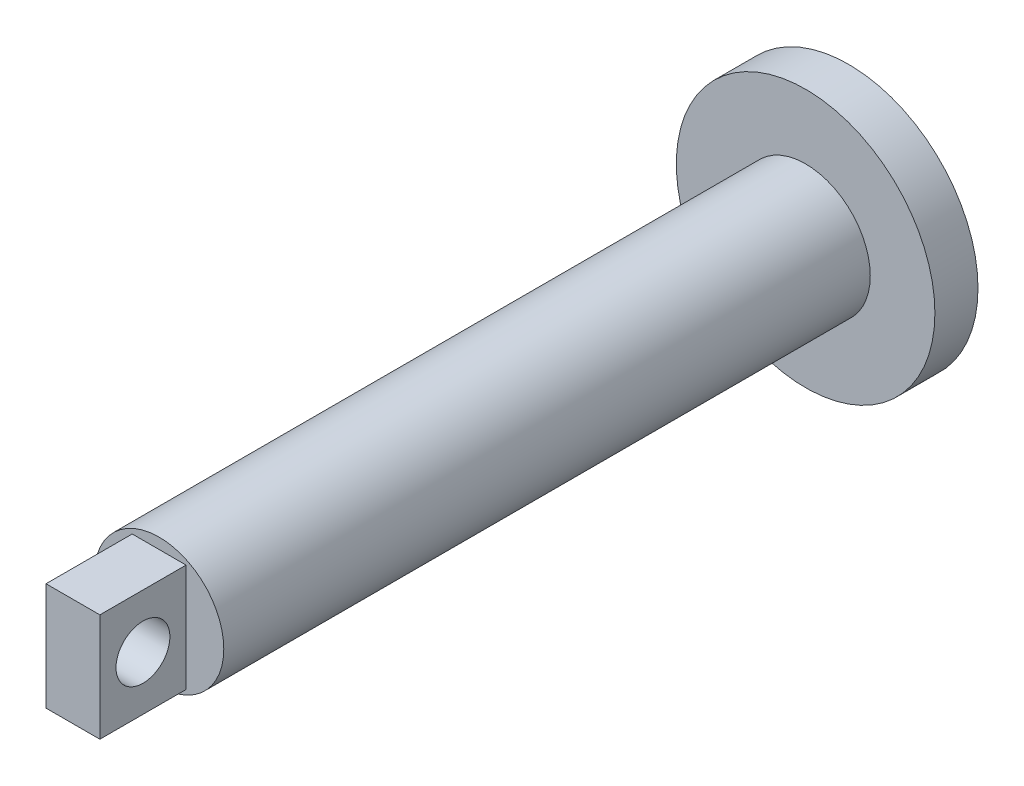
ISO-10303-21;
HEADER;
FILE_DESCRIPTION(('STEP AP214'),'2;1');
FILE_NAME('part.step','',(''),(''),'','','');
FILE_SCHEMA(('AUTOMOTIVE_DESIGN { 1 0 10303 214 1 1 1 1 }'));
ENDSEC;
DATA;
#1=APPLICATION_CONTEXT('core data for automotive mechanical design processes');
#2=APPLICATION_PROTOCOL_DEFINITION('international standard','automotive_design',2000,#1);
#3=PRODUCT_CONTEXT('',#1,'mechanical');
#4=PRODUCT('Part','Part','',(#3));
#5=PRODUCT_RELATED_PRODUCT_CATEGORY('part','',(#4));
#6=PRODUCT_DEFINITION_FORMATION('','',#4);
#7=PRODUCT_DEFINITION_CONTEXT('part definition',#1,'design');
#8=PRODUCT_DEFINITION('design','',#6,#7);
#9=PRODUCT_DEFINITION_SHAPE('','',#8);
#10=(LENGTH_UNIT() NAMED_UNIT(*) SI_UNIT(.MILLI.,.METRE.));
#11=(NAMED_UNIT(*) PLANE_ANGLE_UNIT() SI_UNIT($,.RADIAN.));
#12=(NAMED_UNIT(*) SI_UNIT($,.STERADIAN.) SOLID_ANGLE_UNIT());
#13=UNCERTAINTY_MEASURE_WITH_UNIT(LENGTH_MEASURE(1.E-05),#10,'distance_accuracy_value','');
#14=(GEOMETRIC_REPRESENTATION_CONTEXT(3) GLOBAL_UNCERTAINTY_ASSIGNED_CONTEXT((#13)) GLOBAL_UNIT_ASSIGNED_CONTEXT((#10,
#11,#12)) REPRESENTATION_CONTEXT('',''));
#15=CARTESIAN_POINT('',(0.,0.,0.));
#16=DIRECTION('',(0.,0.,1.));
#17=DIRECTION('',(1.,0.,0.));
#18=AXIS2_PLACEMENT_3D('',#15,#16,#17);
#19=CARTESIAN_POINT('',(0.,0.,2.));
#20=DIRECTION('',(0.,0.,-1.));
#21=DIRECTION('',(-1.,0.,0.));
#22=AXIS2_PLACEMENT_3D('',#19,#20,#21);
#23=CYLINDRICAL_SURFACE('',#22,6.);
#24=CARTESIAN_POINT('',(0.,0.,2.));
#25=DIRECTION('',(0.,0.,1.));
#26=DIRECTION('',(1.,0.,0.));
#27=AXIS2_PLACEMENT_3D('',#24,#25,#26);
#28=CIRCLE('',#27,6.);
#29=CARTESIAN_POINT('',(6.,0.,2.));
#30=VERTEX_POINT('',#29);
#31=EDGE_CURVE('E48',#30,#30,#28,.T.);
#32=ORIENTED_EDGE('',*,*,#31,.F.);
#33=EDGE_LOOP('',(#32));
#34=FACE_BOUND('',#33,.T.);
#35=CARTESIAN_POINT('',(0.,0.,0.));
#36=DIRECTION('',(0.,0.,1.));
#37=DIRECTION('',(1.,0.,0.));
#38=AXIS2_PLACEMENT_3D('',#35,#36,#37);
#39=CIRCLE('',#38,6.);
#40=CARTESIAN_POINT('',(6.,0.,0.));
#41=VERTEX_POINT('',#40);
#42=EDGE_CURVE('E42',#41,#41,#39,.T.);
#43=ORIENTED_EDGE('',*,*,#42,.T.);
#44=EDGE_LOOP('',(#43));
#45=FACE_BOUND('',#44,.T.);
#46=ADVANCED_FACE('F39',(#34,#45),#23,.T.);
#47=CARTESIAN_POINT('',(0.,0.,2.));
#48=DIRECTION('',(0.,0.,1.));
#49=DIRECTION('',(1.,0.,0.));
#50=AXIS2_PLACEMENT_3D('',#47,#48,#49);
#51=PLANE('',#50);
#52=CARTESIAN_POINT('',(0.,0.,2.));
#53=DIRECTION('',(0.,0.,1.));
#54=DIRECTION('',(1.,0.,0.));
#55=AXIS2_PLACEMENT_3D('',#52,#53,#54);
#56=CIRCLE('',#55,3.);
#57=CARTESIAN_POINT('',(3.,0.,2.));
#58=VERTEX_POINT('',#57);
#59=EDGE_CURVE('E11',#58,#58,#56,.T.);
#60=ORIENTED_EDGE('',*,*,#59,.F.);
#61=EDGE_LOOP('',(#60));
#62=FACE_BOUND('',#61,.T.);
#63=ORIENTED_EDGE('',*,*,#31,.T.);
#64=EDGE_LOOP('',(#63));
#65=FACE_BOUND('',#64,.T.);
#66=ADVANCED_FACE('F126',(#62,#65),#51,.T.);
#67=CARTESIAN_POINT('',(0.,0.,0.));
#68=DIRECTION('',(0.,0.,1.));
#69=DIRECTION('',(1.,0.,0.));
#70=AXIS2_PLACEMENT_3D('',#67,#68,#69);
#71=PLANE('',#70);
#72=ORIENTED_EDGE('',*,*,#42,.F.);
#73=EDGE_LOOP('',(#72));
#74=FACE_BOUND('',#73,.T.);
#75=ADVANCED_FACE('F123',(#74),#71,.F.);
#76=CARTESIAN_POINT('',(0.,0.,32.));
#77=DIRECTION('',(0.,0.,-1.));
#78=DIRECTION('',(-1.,0.,0.));
#79=AXIS2_PLACEMENT_3D('',#76,#77,#78);
#80=CYLINDRICAL_SURFACE('',#79,3.);
#81=CARTESIAN_POINT('',(0.,0.,32.));
#82=DIRECTION('',(0.,0.,1.));
#83=DIRECTION('',(1.,0.,0.));
#84=AXIS2_PLACEMENT_3D('',#81,#82,#83);
#85=CIRCLE('',#84,3.);
#86=CARTESIAN_POINT('',(3.,0.,32.));
#87=VERTEX_POINT('',#86);
#88=EDGE_CURVE('E105',#87,#87,#85,.T.);
#89=ORIENTED_EDGE('',*,*,#88,.F.);
#90=EDGE_LOOP('',(#89));
#91=FACE_BOUND('',#90,.T.);
#92=ORIENTED_EDGE('',*,*,#59,.T.);
#93=EDGE_LOOP('',(#92));
#94=FACE_BOUND('',#93,.T.);
#95=ADVANCED_FACE('F125',(#91,#94),#80,.T.);
#96=CARTESIAN_POINT('',(0.,0.,32.));
#97=DIRECTION('',(0.,0.,1.));
#98=DIRECTION('',(1.,0.,0.));
#99=AXIS2_PLACEMENT_3D('',#96,#97,#98);
#100=PLANE('',#99);
#101=DIRECTION('',(0.,1.,0.));
#102=VECTOR('',#101,1.);
#103=CARTESIAN_POINT('',(1.25,-2.5,32.));
#104=LINE('',#103,#102);
#105=CARTESIAN_POINT('',(1.25,-2.5,32.));
#106=VERTEX_POINT('',#105);
#107=CARTESIAN_POINT('',(1.25,2.5,32.));
#108=VERTEX_POINT('',#107);
#109=EDGE_CURVE('E56',#106,#108,#104,.T.);
#110=ORIENTED_EDGE('',*,*,#109,.F.);
#111=DIRECTION('',(1.,0.,0.));
#112=VECTOR('',#111,1.);
#113=CARTESIAN_POINT('',(-1.25,-2.5,32.));
#114=LINE('',#113,#112);
#115=CARTESIAN_POINT('',(-1.25,-2.5,32.));
#116=VERTEX_POINT('',#115);
#117=EDGE_CURVE('E60',#116,#106,#114,.T.);
#118=ORIENTED_EDGE('',*,*,#117,.F.);
#119=DIRECTION('',(0.,-1.,0.));
#120=VECTOR('',#119,1.);
#121=CARTESIAN_POINT('',(-1.25,-2.5,32.));
#122=LINE('',#121,#120);
#123=CARTESIAN_POINT('',(-1.25,2.5,32.));
#124=VERTEX_POINT('',#123);
#125=EDGE_CURVE('E241',#124,#116,#122,.T.);
#126=ORIENTED_EDGE('',*,*,#125,.F.);
#127=DIRECTION('',(-1.,0.,0.));
#128=VECTOR('',#127,1.);
#129=CARTESIAN_POINT('',(-1.25,2.5,32.));
#130=LINE('',#129,#128);
#131=EDGE_CURVE('E230',#108,#124,#130,.T.);
#132=ORIENTED_EDGE('',*,*,#131,.F.);
#133=EDGE_LOOP('',(#110,#118,#126,#132));
#134=FACE_BOUND('',#133,.T.);
#135=ORIENTED_EDGE('',*,*,#88,.T.);
#136=EDGE_LOOP('',(#135));
#137=FACE_BOUND('',#136,.T.);
#138=ADVANCED_FACE('F131',(#134,#137),#100,.T.);
#139=CARTESIAN_POINT('',(1.25,-2.5,36.));
#140=DIRECTION('',(-1.,0.,0.));
#141=DIRECTION('',(0.,0.,1.));
#142=AXIS2_PLACEMENT_3D('',#139,#140,#141);
#143=PLANE('',#142);
#144=CARTESIAN_POINT('',(1.25,0.,34.));
#145=DIRECTION('',(-1.,0.,0.));
#146=DIRECTION('',(0.,0.,1.));
#147=AXIS2_PLACEMENT_3D('',#144,#145,#146);
#148=CIRCLE('',#147,1.25);
#149=CARTESIAN_POINT('',(1.25,0.,35.25));
#150=VERTEX_POINT('',#149);
#151=EDGE_CURVE('E225',#150,#150,#148,.F.);
#152=ORIENTED_EDGE('',*,*,#151,.F.);
#153=EDGE_LOOP('',(#152));
#154=FACE_BOUND('',#153,.T.);
#155=ORIENTED_EDGE('',*,*,#109,.T.);
#156=DIRECTION('',(0.,0.,-1.));
#157=VECTOR('',#156,1.);
#158=CARTESIAN_POINT('',(1.25,2.5,36.));
#159=LINE('',#158,#157);
#160=CARTESIAN_POINT('',(1.25,2.5,36.));
#161=VERTEX_POINT('',#160);
#162=EDGE_CURVE('E85',#161,#108,#159,.T.);
#163=ORIENTED_EDGE('',*,*,#162,.F.);
#164=DIRECTION('',(0.,1.,0.));
#165=VECTOR('',#164,1.);
#166=CARTESIAN_POINT('',(1.25,-2.5,36.));
#167=LINE('',#166,#165);
#168=CARTESIAN_POINT('',(1.25,-2.5,36.));
#169=VERTEX_POINT('',#168);
#170=EDGE_CURVE('E92',#169,#161,#167,.T.);
#171=ORIENTED_EDGE('',*,*,#170,.F.);
#172=DIRECTION('',(0.,0.,-1.));
#173=VECTOR('',#172,1.);
#174=CARTESIAN_POINT('',(1.25,-2.5,36.));
#175=LINE('',#174,#173);
#176=EDGE_CURVE('E237',#169,#106,#175,.T.);
#177=ORIENTED_EDGE('',*,*,#176,.T.);
#178=EDGE_LOOP('',(#155,#163,#171,#177));
#179=FACE_BOUND('',#178,.T.);
#180=ADVANCED_FACE('F103',(#154,#179),#143,.F.);
#181=CARTESIAN_POINT('',(-1.25,2.5,36.));
#182=DIRECTION('',(0.,-1.,0.));
#183=DIRECTION('',(0.,0.,-1.));
#184=AXIS2_PLACEMENT_3D('',#181,#182,#183);
#185=PLANE('',#184);
#186=ORIENTED_EDGE('',*,*,#131,.T.);
#187=DIRECTION('',(0.,0.,-1.));
#188=VECTOR('',#187,1.);
#189=CARTESIAN_POINT('',(-1.25,2.5,36.));
#190=LINE('',#189,#188);
#191=CARTESIAN_POINT('',(-1.25,2.5,36.));
#192=VERTEX_POINT('',#191);
#193=EDGE_CURVE('E87',#192,#124,#190,.T.);
#194=ORIENTED_EDGE('',*,*,#193,.F.);
#195=DIRECTION('',(-1.,0.,0.));
#196=VECTOR('',#195,1.);
#197=CARTESIAN_POINT('',(-1.25,2.5,36.));
#198=LINE('',#197,#196);
#199=EDGE_CURVE('E80',#161,#192,#198,.T.);
#200=ORIENTED_EDGE('',*,*,#199,.F.);
#201=ORIENTED_EDGE('',*,*,#162,.T.);
#202=EDGE_LOOP('',(#186,#194,#200,#201));
#203=FACE_BOUND('',#202,.T.);
#204=ADVANCED_FACE('F83',(#203),#185,.F.);
#205=CARTESIAN_POINT('',(-1.25,-2.5,36.));
#206=DIRECTION('',(1.,0.,0.));
#207=DIRECTION('',(0.,0.,-1.));
#208=AXIS2_PLACEMENT_3D('',#205,#206,#207);
#209=PLANE('',#208);
#210=CARTESIAN_POINT('',(-1.25,0.,34.));
#211=DIRECTION('',(-1.,0.,0.));
#212=DIRECTION('',(0.,0.,1.));
#213=AXIS2_PLACEMENT_3D('',#210,#211,#212);
#214=CIRCLE('',#213,1.25);
#215=CARTESIAN_POINT('',(-1.25,0.,35.25));
#216=VERTEX_POINT('',#215);
#217=EDGE_CURVE('E222',#216,#216,#214,.T.);
#218=ORIENTED_EDGE('',*,*,#217,.F.);
#219=EDGE_LOOP('',(#218));
#220=FACE_BOUND('',#219,.T.);
#221=ORIENTED_EDGE('',*,*,#125,.T.);
#222=DIRECTION('',(0.,0.,-1.));
#223=VECTOR('',#222,1.);
#224=CARTESIAN_POINT('',(-1.25,-2.5,36.));
#225=LINE('',#224,#223);
#226=CARTESIAN_POINT('',(-1.25,-2.5,36.));
#227=VERTEX_POINT('',#226);
#228=EDGE_CURVE('E111',#227,#116,#225,.T.);
#229=ORIENTED_EDGE('',*,*,#228,.F.);
#230=DIRECTION('',(0.,-1.,0.));
#231=VECTOR('',#230,1.);
#232=CARTESIAN_POINT('',(-1.25,-2.5,36.));
#233=LINE('',#232,#231);
#234=EDGE_CURVE('E91',#192,#227,#233,.T.);
#235=ORIENTED_EDGE('',*,*,#234,.F.);
#236=ORIENTED_EDGE('',*,*,#193,.T.);
#237=EDGE_LOOP('',(#221,#229,#235,#236));
#238=FACE_BOUND('',#237,.T.);
#239=ADVANCED_FACE('F171',(#220,#238),#209,.F.);
#240=CARTESIAN_POINT('',(-1.25,-2.5,36.));
#241=DIRECTION('',(0.,1.,0.));
#242=DIRECTION('',(0.,0.,1.));
#243=AXIS2_PLACEMENT_3D('',#240,#241,#242);
#244=PLANE('',#243);
#245=ORIENTED_EDGE('',*,*,#117,.T.);
#246=ORIENTED_EDGE('',*,*,#176,.F.);
#247=DIRECTION('',(1.,0.,0.));
#248=VECTOR('',#247,1.);
#249=CARTESIAN_POINT('',(-1.25,-2.5,36.));
#250=LINE('',#249,#248);
#251=EDGE_CURVE('E97',#227,#169,#250,.T.);
#252=ORIENTED_EDGE('',*,*,#251,.F.);
#253=ORIENTED_EDGE('',*,*,#228,.T.);
#254=EDGE_LOOP('',(#245,#246,#252,#253));
#255=FACE_BOUND('',#254,.T.);
#256=ADVANCED_FACE('F178',(#255),#244,.F.);
#257=CARTESIAN_POINT('',(0.,0.,36.));
#258=DIRECTION('',(0.,0.,-1.));
#259=DIRECTION('',(-1.,0.,0.));
#260=AXIS2_PLACEMENT_3D('',#257,#258,#259);
#261=PLANE('',#260);
#262=ORIENTED_EDGE('',*,*,#170,.T.);
#263=ORIENTED_EDGE('',*,*,#199,.T.);
#264=ORIENTED_EDGE('',*,*,#234,.T.);
#265=ORIENTED_EDGE('',*,*,#251,.T.);
#266=EDGE_LOOP('',(#262,#263,#264,#265));
#267=FACE_BOUND('',#266,.T.);
#268=ADVANCED_FACE('F95',(#267),#261,.F.);
#269=CARTESIAN_POINT('',(6.001,0.,34.));
#270=DIRECTION('',(-1.,0.,0.));
#271=DIRECTION('',(0.,0.,1.));
#272=AXIS2_PLACEMENT_3D('',#269,#270,#271);
#273=CYLINDRICAL_SURFACE('',#272,1.25);
#274=CARTESIAN_POINT('',(-1.25,0.,35.25));
#275=CARTESIAN_POINT('',(-1.22395833333333,0.,35.25));
#276=CARTESIAN_POINT('',(-1.19791666666667,0.,35.25));
#277=CARTESIAN_POINT('',(-1.14583333333333,0.,35.25));
#278=CARTESIAN_POINT('',(-1.11979166666667,0.,35.25));
#279=CARTESIAN_POINT('',(-1.06770833333333,0.,35.25));
#280=CARTESIAN_POINT('',(-1.04166666666667,0.,35.25));
#281=CARTESIAN_POINT('',(-0.989583333333333,0.,35.25));
#282=CARTESIAN_POINT('',(-0.963541666666667,0.,35.25));
#283=CARTESIAN_POINT('',(-0.911458333333333,0.,35.25));
#284=CARTESIAN_POINT('',(-0.885416666666667,0.,35.25));
#285=CARTESIAN_POINT('',(-0.833333333333333,0.,35.25));
#286=CARTESIAN_POINT('',(-0.807291666666667,0.,35.25));
#287=CARTESIAN_POINT('',(-0.755208333333333,0.,35.25));
#288=CARTESIAN_POINT('',(-0.729166666666667,0.,35.25));
#289=CARTESIAN_POINT('',(-0.677083333333333,0.,35.25));
#290=CARTESIAN_POINT('',(-0.651041666666666,0.,35.25));
#291=CARTESIAN_POINT('',(-0.598958333333333,0.,35.25));
#292=CARTESIAN_POINT('',(-0.572916666666666,0.,35.25));
#293=CARTESIAN_POINT('',(-0.520833333333333,0.,35.25));
#294=CARTESIAN_POINT('',(-0.494791666666667,0.,35.25));
#295=CARTESIAN_POINT('',(-0.442708333333334,0.,35.25));
#296=CARTESIAN_POINT('',(-0.416666666666667,0.,35.25));
#297=CARTESIAN_POINT('',(-0.364583333333334,0.,35.25));
#298=CARTESIAN_POINT('',(-0.338541666666667,0.,35.25));
#299=CARTESIAN_POINT('',(-0.286458333333334,0.,35.25));
#300=CARTESIAN_POINT('',(-0.260416666666667,0.,35.25));
#301=CARTESIAN_POINT('',(-0.208333333333334,0.,35.25));
#302=CARTESIAN_POINT('',(-0.182291666666667,0.,35.25));
#303=CARTESIAN_POINT('',(-0.130208333333333,0.,35.25));
#304=CARTESIAN_POINT('',(-0.104166666666667,0.,35.25));
#305=CARTESIAN_POINT('',(-0.0520833333333334,0.,35.25));
#306=CARTESIAN_POINT('',(-0.0260416666666667,0.,35.25));
#307=CARTESIAN_POINT('',(0.0260416666666667,0.,35.25));
#308=CARTESIAN_POINT('',(0.0520833333333334,0.,35.25));
#309=CARTESIAN_POINT('',(0.104166666666667,0.,35.25));
#310=CARTESIAN_POINT('',(0.130208333333333,0.,35.25));
#311=CARTESIAN_POINT('',(0.182291666666667,0.,35.25));
#312=CARTESIAN_POINT('',(0.208333333333334,0.,35.25));
#313=CARTESIAN_POINT('',(0.260416666666667,0.,35.25));
#314=CARTESIAN_POINT('',(0.286458333333334,0.,35.25));
#315=CARTESIAN_POINT('',(0.338541666666667,0.,35.25));
#316=CARTESIAN_POINT('',(0.364583333333334,0.,35.25));
#317=CARTESIAN_POINT('',(0.416666666666667,0.,35.25));
#318=CARTESIAN_POINT('',(0.442708333333333,0.,35.25));
#319=CARTESIAN_POINT('',(0.494791666666666,0.,35.25));
#320=CARTESIAN_POINT('',(0.520833333333333,0.,35.25));
#321=CARTESIAN_POINT('',(0.572916666666666,0.,35.25));
#322=CARTESIAN_POINT('',(0.598958333333333,0.,35.25));
#323=CARTESIAN_POINT('',(0.651041666666666,0.,35.25));
#324=CARTESIAN_POINT('',(0.677083333333333,0.,35.25));
#325=CARTESIAN_POINT('',(0.729166666666667,0.,35.25));
#326=CARTESIAN_POINT('',(0.755208333333333,0.,35.25));
#327=CARTESIAN_POINT('',(0.807291666666667,0.,35.25));
#328=CARTESIAN_POINT('',(0.833333333333333,0.,35.25));
#329=CARTESIAN_POINT('',(0.885416666666667,0.,35.25));
#330=CARTESIAN_POINT('',(0.911458333333333,0.,35.25));
#331=CARTESIAN_POINT('',(0.963541666666667,0.,35.25));
#332=CARTESIAN_POINT('',(0.989583333333333,0.,35.25));
#333=CARTESIAN_POINT('',(1.04166666666667,0.,35.25));
#334=CARTESIAN_POINT('',(1.06770833333333,0.,35.25));
#335=CARTESIAN_POINT('',(1.11979166666667,0.,35.25));
#336=CARTESIAN_POINT('',(1.14583333333333,0.,35.25));
#337=CARTESIAN_POINT('',(1.19791666666667,0.,35.25));
#338=CARTESIAN_POINT('',(1.22395833333333,0.,35.25));
#339=CARTESIAN_POINT('',(1.25,0.,35.25));
#340=B_SPLINE_CURVE_WITH_KNOTS('',3,(#274,#275,#276,#277,#278,#279,#280,#281,#282,#283,#284,
#285,#286,#287,#288,#289,#290,#291,#292,#293,#294,#295,#296,#297,#298,#299,#300,#301,#302,#303,
#304,#305,#306,#307,#308,#309,#310,#311,#312,#313,#314,#315,#316,#317,#318,#319,#320,#321,#322,
#323,#324,#325,#326,#327,#328,#329,#330,#331,#332,#333,#334,#335,#336,#337,#338,#339),
.UNSPECIFIED.,.F.,.F.,(4,2,2,2,2,2,2,2,2,2,2,2,2,2,2,2,2,2,2,2,2,2,2,2,2,2,2,2,2,2,2,2,4),(0.,
0.0781250000000001,0.15625,0.234375,0.3125,0.390625,0.46875,0.546875,0.625000000000001,
0.703125000000001,0.78125,0.859375,0.9375,1.015625,1.09375,1.171875,1.25,1.328125,1.40625,
1.484375,1.5625,1.640625,1.71875,1.796875,1.875,1.953125,2.03125,2.109375,2.1875,2.265625,
2.34375,2.421875,2.5),.UNSPECIFIED.);
#341=EDGE_CURVE('BSEAM192',#216,#150,#340,.T.);
#342=ORIENTED_EDGE('',*,*,#217,.T.);
#343=ORIENTED_EDGE('',*,*,#151,.T.);
#344=ORIENTED_EDGE('',*,*,#341,.T.);
#345=ORIENTED_EDGE('',*,*,#341,.F.);
#346=EDGE_LOOP('',(#342,#344,#343,#345));
#347=FACE_BOUND('',#346,.T.);
#348=ADVANCED_FACE('F192',(#347),#273,.F.);
#349=CLOSED_SHELL('',(#46,#66,#75,#95,#138,#180,#204,#239,#256,#268,#348));
#350=MANIFOLD_SOLID_BREP('B2',#349);
#351=ADVANCED_BREP_SHAPE_REPRESENTATION('',(#18,#350),#14);
#352=SHAPE_DEFINITION_REPRESENTATION(#9,#351);
ENDSEC;
END-ISO-10303-21;
